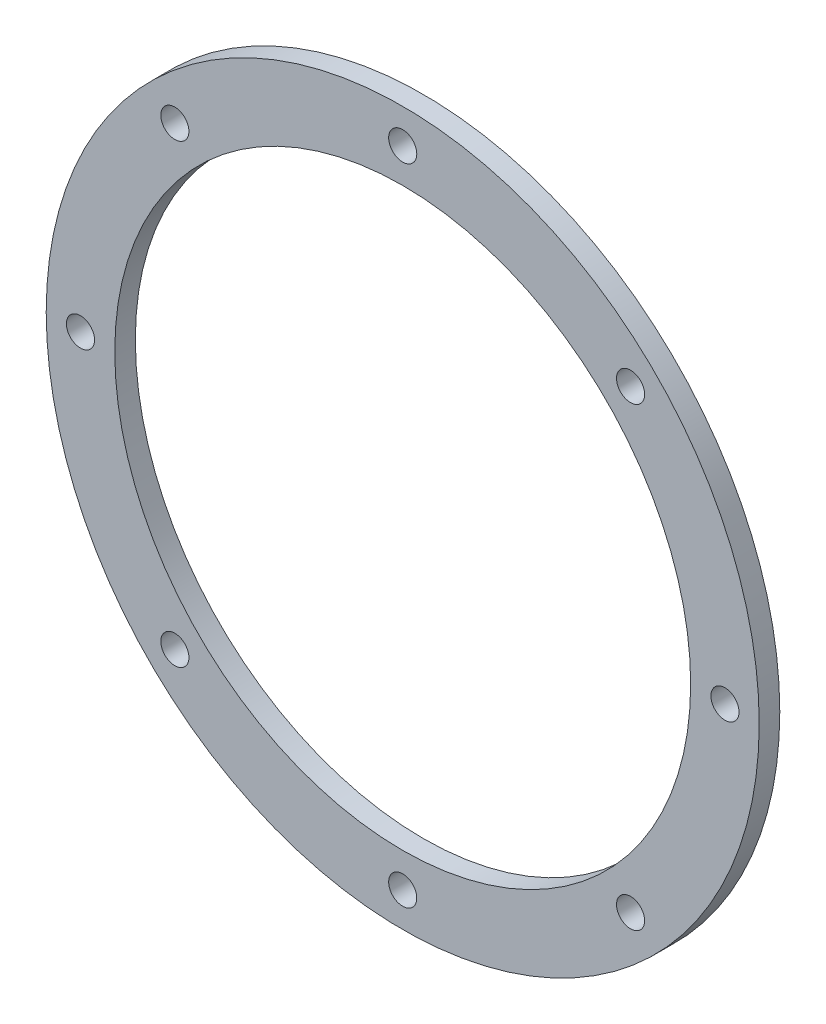
ISO-10303-21;
HEADER;
FILE_DESCRIPTION(('STEP AP214'),'2;1');
FILE_NAME('part.step','',(''),(''),'','','');
FILE_SCHEMA(('AUTOMOTIVE_DESIGN { 1 0 10303 214 1 1 1 1 }'));
ENDSEC;
DATA;
#1=APPLICATION_CONTEXT('core data for automotive mechanical design processes');
#2=APPLICATION_PROTOCOL_DEFINITION('international standard','automotive_design',2000,#1);
#3=PRODUCT_CONTEXT('',#1,'mechanical');
#4=PRODUCT('Part','Part','',(#3));
#5=PRODUCT_RELATED_PRODUCT_CATEGORY('part','',(#4));
#6=PRODUCT_DEFINITION_FORMATION('','',#4);
#7=PRODUCT_DEFINITION_CONTEXT('part definition',#1,'design');
#8=PRODUCT_DEFINITION('design','',#6,#7);
#9=PRODUCT_DEFINITION_SHAPE('','',#8);
#10=(LENGTH_UNIT() NAMED_UNIT(*) SI_UNIT(.MILLI.,.METRE.));
#11=(NAMED_UNIT(*) PLANE_ANGLE_UNIT() SI_UNIT($,.RADIAN.));
#12=(NAMED_UNIT(*) SI_UNIT($,.STERADIAN.) SOLID_ANGLE_UNIT());
#13=UNCERTAINTY_MEASURE_WITH_UNIT(LENGTH_MEASURE(1.E-05),#10,'distance_accuracy_value','');
#14=(GEOMETRIC_REPRESENTATION_CONTEXT(3) GLOBAL_UNCERTAINTY_ASSIGNED_CONTEXT((#13)) GLOBAL_UNIT_ASSIGNED_CONTEXT((#10,
#11,#12)) REPRESENTATION_CONTEXT('',''));
#15=CARTESIAN_POINT('',(0.,0.,0.));
#16=DIRECTION('',(0.,0.,1.));
#17=DIRECTION('',(1.,0.,0.));
#18=AXIS2_PLACEMENT_3D('',#15,#16,#17);
#19=CARTESIAN_POINT('',(0.,0.,3.));
#20=DIRECTION('',(0.,0.,1.));
#21=DIRECTION('',(1.,0.,0.));
#22=AXIS2_PLACEMENT_3D('',#19,#20,#21);
#23=PLANE('',#22);
#24=CARTESIAN_POINT('',(33.2340187157673,33.2340187157681,3.));
#25=DIRECTION('',(0.,0.,1.));
#26=DIRECTION('',(0.707106781186556,-0.707106781186539,0.));
#27=AXIS2_PLACEMENT_3D('',#24,#25,#26);
#28=CIRCLE('',#27,2.05);
#29=CARTESIAN_POINT('',(34.6835876171998,31.7844498143357,3.));
#30=VERTEX_POINT('',#29);
#31=EDGE_CURVE('E92',#30,#30,#28,.T.);
#32=ORIENTED_EDGE('',*,*,#31,.F.);
#33=EDGE_LOOP('',(#32));
#34=FACE_BOUND('',#33,.T.);
#35=CARTESIAN_POINT('',(47.,4.9236661129888E-13,3.));
#36=DIRECTION('',(0.,0.,1.));
#37=DIRECTION('',(0.,-1.,0.));
#38=AXIS2_PLACEMENT_3D('',#35,#36,#37);
#39=CIRCLE('',#38,2.05);
#40=CARTESIAN_POINT('',(47.,-2.04999999999951,3.));
#41=VERTEX_POINT('',#40);
#42=EDGE_CURVE('E86',#41,#41,#39,.T.);
#43=ORIENTED_EDGE('',*,*,#42,.F.);
#44=EDGE_LOOP('',(#43));
#45=FACE_BOUND('',#44,.T.);
#46=CARTESIAN_POINT('',(33.234018715768,-33.2340187157674,3.));
#47=DIRECTION('',(0.,0.,1.));
#48=DIRECTION('',(-0.707106781186541,-0.707106781186554,0.));
#49=AXIS2_PLACEMENT_3D('',#46,#47,#48);
#50=CIRCLE('',#49,2.05);
#51=CARTESIAN_POINT('',(31.7844498143356,-34.6835876171999,3.));
#52=VERTEX_POINT('',#51);
#53=EDGE_CURVE('E80',#52,#52,#50,.T.);
#54=ORIENTED_EDGE('',*,*,#53,.F.);
#55=EDGE_LOOP('',(#54));
#56=FACE_BOUND('',#55,.T.);
#57=CARTESIAN_POINT('',(0.,-47.,3.));
#58=DIRECTION('',(0.,0.,1.));
#59=DIRECTION('',(-1.,0.,0.));
#60=AXIS2_PLACEMENT_3D('',#57,#58,#59);
#61=CIRCLE('',#60,2.05);
#62=CARTESIAN_POINT('',(-2.05,-47.,3.));
#63=VERTEX_POINT('',#62);
#64=EDGE_CURVE('E74',#63,#63,#61,.T.);
#65=ORIENTED_EDGE('',*,*,#64,.F.);
#66=EDGE_LOOP('',(#65));
#67=FACE_BOUND('',#66,.T.);
#68=CARTESIAN_POINT('',(-33.2340187157676,-33.2340187157679,3.));
#69=DIRECTION('',(0.,0.,1.));
#70=DIRECTION('',(-0.707106781186551,0.707106781186544,0.));
#71=AXIS2_PLACEMENT_3D('',#68,#69,#70);
#72=CIRCLE('',#71,2.05);
#73=CARTESIAN_POINT('',(-34.6835876172,-31.7844498143355,3.));
#74=VERTEX_POINT('',#73);
#75=EDGE_CURVE('E68',#74,#74,#72,.T.);
#76=ORIENTED_EDGE('',*,*,#75,.F.);
#77=EDGE_LOOP('',(#76));
#78=FACE_BOUND('',#77,.T.);
#79=CARTESIAN_POINT('',(-47.,-1.64167365447625E-13,3.));
#80=DIRECTION('',(0.,0.,1.));
#81=DIRECTION('',(0.,1.,0.));
#82=AXIS2_PLACEMENT_3D('',#79,#80,#81);
#83=CIRCLE('',#82,2.05);
#84=CARTESIAN_POINT('',(-47.,2.04999999999984,3.));
#85=VERTEX_POINT('',#84);
#86=EDGE_CURVE('E62',#85,#85,#83,.T.);
#87=ORIENTED_EDGE('',*,*,#86,.F.);
#88=EDGE_LOOP('',(#87));
#89=FACE_BOUND('',#88,.T.);
#90=CARTESIAN_POINT('',(-33.2340187157678,33.2340187157677,3.));
#91=DIRECTION('',(0.,0.,1.));
#92=DIRECTION('',(0.707106781186546,0.707106781186549,0.));
#93=AXIS2_PLACEMENT_3D('',#90,#91,#92);
#94=CIRCLE('',#93,2.05);
#95=CARTESIAN_POINT('',(-31.7844498143354,34.6835876172001,3.));
#96=VERTEX_POINT('',#95);
#97=EDGE_CURVE('E56',#96,#96,#94,.T.);
#98=ORIENTED_EDGE('',*,*,#97,.F.);
#99=EDGE_LOOP('',(#98));
#100=FACE_BOUND('',#99,.T.);
#101=CARTESIAN_POINT('',(0.,47.,3.));
#102=DIRECTION('',(0.,0.,1.));
#103=DIRECTION('',(1.,0.,0.));
#104=AXIS2_PLACEMENT_3D('',#101,#102,#103);
#105=CIRCLE('',#104,2.05);
#106=CARTESIAN_POINT('',(2.05,47.,3.));
#107=VERTEX_POINT('',#106);
#108=EDGE_CURVE('E50',#107,#107,#105,.T.);
#109=ORIENTED_EDGE('',*,*,#108,.F.);
#110=EDGE_LOOP('',(#109));
#111=FACE_BOUND('',#110,.T.);
#112=CARTESIAN_POINT('',(0.,0.,3.));
#113=DIRECTION('',(0.,0.,1.));
#114=DIRECTION('',(1.,0.,0.));
#115=AXIS2_PLACEMENT_3D('',#112,#113,#114);
#116=CIRCLE('',#115,52.);
#117=CARTESIAN_POINT('',(52.,0.,3.));
#118=VERTEX_POINT('',#117);
#119=EDGE_CURVE('E10',#118,#118,#116,.T.);
#120=ORIENTED_EDGE('',*,*,#119,.T.);
#121=EDGE_LOOP('',(#120));
#122=FACE_BOUND('',#121,.T.);
#123=CARTESIAN_POINT('',(0.,0.,3.));
#124=DIRECTION('',(0.,0.,1.));
#125=DIRECTION('',(1.,0.,0.));
#126=AXIS2_PLACEMENT_3D('',#123,#124,#125);
#127=CIRCLE('',#126,42.);
#128=CARTESIAN_POINT('',(42.,0.,3.));
#129=VERTEX_POINT('',#128);
#130=EDGE_CURVE('E42',#129,#129,#127,.T.);
#131=ORIENTED_EDGE('',*,*,#130,.F.);
#132=EDGE_LOOP('',(#131));
#133=FACE_BOUND('',#132,.T.);
#134=ADVANCED_FACE('F31',(#34,#45,#56,#67,#78,#89,#100,#111,#122,#133),#23,.T.);
#135=CARTESIAN_POINT('',(0.,0.,0.));
#136=DIRECTION('',(0.,0.,1.));
#137=DIRECTION('',(1.,0.,0.));
#138=AXIS2_PLACEMENT_3D('',#135,#136,#137);
#139=PLANE('',#138);
#140=CARTESIAN_POINT('',(33.2340187157673,33.2340187157681,0.));
#141=DIRECTION('',(0.,0.,1.));
#142=DIRECTION('',(0.707106781186556,-0.707106781186539,0.));
#143=AXIS2_PLACEMENT_3D('',#140,#141,#142);
#144=CIRCLE('',#143,2.05);
#145=CARTESIAN_POINT('',(34.6835876171998,31.7844498143357,0.));
#146=VERTEX_POINT('',#145);
#147=EDGE_CURVE('E89',#146,#146,#144,.T.);
#148=ORIENTED_EDGE('',*,*,#147,.T.);
#149=EDGE_LOOP('',(#148));
#150=FACE_BOUND('',#149,.T.);
#151=CARTESIAN_POINT('',(47.,4.9236661129888E-13,0.));
#152=DIRECTION('',(0.,0.,1.));
#153=DIRECTION('',(0.,-1.,0.));
#154=AXIS2_PLACEMENT_3D('',#151,#152,#153);
#155=CIRCLE('',#154,2.05);
#156=CARTESIAN_POINT('',(47.,-2.04999999999951,0.));
#157=VERTEX_POINT('',#156);
#158=EDGE_CURVE('E83',#157,#157,#155,.T.);
#159=ORIENTED_EDGE('',*,*,#158,.T.);
#160=EDGE_LOOP('',(#159));
#161=FACE_BOUND('',#160,.T.);
#162=CARTESIAN_POINT('',(33.234018715768,-33.2340187157674,0.));
#163=DIRECTION('',(0.,0.,1.));
#164=DIRECTION('',(-0.707106781186541,-0.707106781186554,0.));
#165=AXIS2_PLACEMENT_3D('',#162,#163,#164);
#166=CIRCLE('',#165,2.05);
#167=CARTESIAN_POINT('',(31.7844498143356,-34.6835876171999,0.));
#168=VERTEX_POINT('',#167);
#169=EDGE_CURVE('E77',#168,#168,#166,.T.);
#170=ORIENTED_EDGE('',*,*,#169,.T.);
#171=EDGE_LOOP('',(#170));
#172=FACE_BOUND('',#171,.T.);
#173=CARTESIAN_POINT('',(0.,-47.,0.));
#174=DIRECTION('',(0.,0.,1.));
#175=DIRECTION('',(-1.,0.,0.));
#176=AXIS2_PLACEMENT_3D('',#173,#174,#175);
#177=CIRCLE('',#176,2.05);
#178=CARTESIAN_POINT('',(-2.05,-47.,0.));
#179=VERTEX_POINT('',#178);
#180=EDGE_CURVE('E71',#179,#179,#177,.T.);
#181=ORIENTED_EDGE('',*,*,#180,.T.);
#182=EDGE_LOOP('',(#181));
#183=FACE_BOUND('',#182,.T.);
#184=CARTESIAN_POINT('',(-33.2340187157676,-33.2340187157679,0.));
#185=DIRECTION('',(0.,0.,1.));
#186=DIRECTION('',(-0.707106781186551,0.707106781186544,0.));
#187=AXIS2_PLACEMENT_3D('',#184,#185,#186);
#188=CIRCLE('',#187,2.05);
#189=CARTESIAN_POINT('',(-34.6835876172,-31.7844498143355,0.));
#190=VERTEX_POINT('',#189);
#191=EDGE_CURVE('E65',#190,#190,#188,.T.);
#192=ORIENTED_EDGE('',*,*,#191,.T.);
#193=EDGE_LOOP('',(#192));
#194=FACE_BOUND('',#193,.T.);
#195=CARTESIAN_POINT('',(-47.,-1.64167365447625E-13,0.));
#196=DIRECTION('',(0.,0.,1.));
#197=DIRECTION('',(0.,1.,0.));
#198=AXIS2_PLACEMENT_3D('',#195,#196,#197);
#199=CIRCLE('',#198,2.05);
#200=CARTESIAN_POINT('',(-47.,2.04999999999984,0.));
#201=VERTEX_POINT('',#200);
#202=EDGE_CURVE('E59',#201,#201,#199,.T.);
#203=ORIENTED_EDGE('',*,*,#202,.T.);
#204=EDGE_LOOP('',(#203));
#205=FACE_BOUND('',#204,.T.);
#206=CARTESIAN_POINT('',(-33.2340187157678,33.2340187157677,0.));
#207=DIRECTION('',(0.,0.,1.));
#208=DIRECTION('',(0.707106781186546,0.707106781186549,0.));
#209=AXIS2_PLACEMENT_3D('',#206,#207,#208);
#210=CIRCLE('',#209,2.05);
#211=CARTESIAN_POINT('',(-31.7844498143354,34.6835876172001,0.));
#212=VERTEX_POINT('',#211);
#213=EDGE_CURVE('E53',#212,#212,#210,.T.);
#214=ORIENTED_EDGE('',*,*,#213,.T.);
#215=EDGE_LOOP('',(#214));
#216=FACE_BOUND('',#215,.T.);
#217=CARTESIAN_POINT('',(0.,47.,0.));
#218=DIRECTION('',(0.,0.,1.));
#219=DIRECTION('',(1.,0.,0.));
#220=AXIS2_PLACEMENT_3D('',#217,#218,#219);
#221=CIRCLE('',#220,2.05);
#222=CARTESIAN_POINT('',(2.05,47.,0.));
#223=VERTEX_POINT('',#222);
#224=EDGE_CURVE('E47',#223,#223,#221,.T.);
#225=ORIENTED_EDGE('',*,*,#224,.T.);
#226=EDGE_LOOP('',(#225));
#227=FACE_BOUND('',#226,.T.);
#228=CARTESIAN_POINT('',(0.,0.,0.));
#229=DIRECTION('',(0.,0.,1.));
#230=DIRECTION('',(1.,0.,0.));
#231=AXIS2_PLACEMENT_3D('',#228,#229,#230);
#232=CIRCLE('',#231,52.);
#233=CARTESIAN_POINT('',(52.,0.,0.));
#234=VERTEX_POINT('',#233);
#235=EDGE_CURVE('E35',#234,#234,#232,.T.);
#236=ORIENTED_EDGE('',*,*,#235,.F.);
#237=EDGE_LOOP('',(#236));
#238=FACE_BOUND('',#237,.T.);
#239=CARTESIAN_POINT('',(0.,0.,0.));
#240=DIRECTION('',(0.,0.,1.));
#241=DIRECTION('',(1.,0.,0.));
#242=AXIS2_PLACEMENT_3D('',#239,#240,#241);
#243=CIRCLE('',#242,42.);
#244=CARTESIAN_POINT('',(42.,0.,0.));
#245=VERTEX_POINT('',#244);
#246=EDGE_CURVE('E44',#245,#245,#243,.T.);
#247=ORIENTED_EDGE('',*,*,#246,.T.);
#248=EDGE_LOOP('',(#247));
#249=FACE_BOUND('',#248,.T.);
#250=ADVANCED_FACE('F98',(#150,#161,#172,#183,#194,#205,#216,#227,#238,#249),#139,.F.);
#251=CARTESIAN_POINT('',(0.,0.,3.));
#252=DIRECTION('',(0.,0.,-1.));
#253=DIRECTION('',(-1.,0.,0.));
#254=AXIS2_PLACEMENT_3D('',#251,#252,#253);
#255=CYLINDRICAL_SURFACE('',#254,52.);
#256=ORIENTED_EDGE('',*,*,#119,.F.);
#257=EDGE_LOOP('',(#256));
#258=FACE_BOUND('',#257,.T.);
#259=ORIENTED_EDGE('',*,*,#235,.T.);
#260=EDGE_LOOP('',(#259));
#261=FACE_BOUND('',#260,.T.);
#262=ADVANCED_FACE('F33',(#258,#261),#255,.T.);
#263=CARTESIAN_POINT('',(0.,0.,3.));
#264=DIRECTION('',(0.,0.,-1.));
#265=DIRECTION('',(-1.,0.,0.));
#266=AXIS2_PLACEMENT_3D('',#263,#264,#265);
#267=CYLINDRICAL_SURFACE('',#266,42.);
#268=ORIENTED_EDGE('',*,*,#130,.T.);
#269=EDGE_LOOP('',(#268));
#270=FACE_BOUND('',#269,.T.);
#271=ORIENTED_EDGE('',*,*,#246,.F.);
#272=EDGE_LOOP('',(#271));
#273=FACE_BOUND('',#272,.T.);
#274=ADVANCED_FACE('F127',(#270,#273),#267,.F.);
#275=CARTESIAN_POINT('',(0.,47.,0.));
#276=DIRECTION('',(0.,0.,1.));
#277=DIRECTION('',(1.,0.,0.));
#278=AXIS2_PLACEMENT_3D('',#275,#276,#277);
#279=CYLINDRICAL_SURFACE('',#278,2.05);
#280=ORIENTED_EDGE('',*,*,#224,.F.);
#281=EDGE_LOOP('',(#280));
#282=FACE_BOUND('',#281,.T.);
#283=ORIENTED_EDGE('',*,*,#108,.T.);
#284=EDGE_LOOP('',(#283));
#285=FACE_BOUND('',#284,.T.);
#286=ADVANCED_FACE('F130',(#282,#285),#279,.F.);
#287=CARTESIAN_POINT('',(-33.2340187157678,33.2340187157677,0.));
#288=DIRECTION('',(0.,0.,1.));
#289=DIRECTION('',(1.,0.,0.));
#290=AXIS2_PLACEMENT_3D('',#287,#288,#289);
#291=CYLINDRICAL_SURFACE('',#290,2.05);
#292=ORIENTED_EDGE('',*,*,#213,.F.);
#293=EDGE_LOOP('',(#292));
#294=FACE_BOUND('',#293,.T.);
#295=ORIENTED_EDGE('',*,*,#97,.T.);
#296=EDGE_LOOP('',(#295));
#297=FACE_BOUND('',#296,.T.);
#298=ADVANCED_FACE('F142',(#294,#297),#291,.F.);
#299=CARTESIAN_POINT('',(-47.,-1.64167365447625E-13,0.));
#300=DIRECTION('',(0.,0.,1.));
#301=DIRECTION('',(1.,0.,0.));
#302=AXIS2_PLACEMENT_3D('',#299,#300,#301);
#303=CYLINDRICAL_SURFACE('',#302,2.05);
#304=ORIENTED_EDGE('',*,*,#202,.F.);
#305=EDGE_LOOP('',(#304));
#306=FACE_BOUND('',#305,.T.);
#307=ORIENTED_EDGE('',*,*,#86,.T.);
#308=EDGE_LOOP('',(#307));
#309=FACE_BOUND('',#308,.T.);
#310=ADVANCED_FACE('F146',(#306,#309),#303,.F.);
#311=CARTESIAN_POINT('',(-33.2340187157676,-33.2340187157679,0.));
#312=DIRECTION('',(0.,0.,1.));
#313=DIRECTION('',(1.,0.,0.));
#314=AXIS2_PLACEMENT_3D('',#311,#312,#313);
#315=CYLINDRICAL_SURFACE('',#314,2.05);
#316=ORIENTED_EDGE('',*,*,#191,.F.);
#317=EDGE_LOOP('',(#316));
#318=FACE_BOUND('',#317,.T.);
#319=ORIENTED_EDGE('',*,*,#75,.T.);
#320=EDGE_LOOP('',(#319));
#321=FACE_BOUND('',#320,.T.);
#322=ADVANCED_FACE('F150',(#318,#321),#315,.F.);
#323=CARTESIAN_POINT('',(0.,-47.,0.));
#324=DIRECTION('',(0.,0.,1.));
#325=DIRECTION('',(1.,0.,0.));
#326=AXIS2_PLACEMENT_3D('',#323,#324,#325);
#327=CYLINDRICAL_SURFACE('',#326,2.05);
#328=ORIENTED_EDGE('',*,*,#180,.F.);
#329=EDGE_LOOP('',(#328));
#330=FACE_BOUND('',#329,.T.);
#331=ORIENTED_EDGE('',*,*,#64,.T.);
#332=EDGE_LOOP('',(#331));
#333=FACE_BOUND('',#332,.T.);
#334=ADVANCED_FACE('F154',(#330,#333),#327,.F.);
#335=CARTESIAN_POINT('',(33.234018715768,-33.2340187157674,0.));
#336=DIRECTION('',(0.,0.,1.));
#337=DIRECTION('',(1.,0.,0.));
#338=AXIS2_PLACEMENT_3D('',#335,#336,#337);
#339=CYLINDRICAL_SURFACE('',#338,2.05);
#340=ORIENTED_EDGE('',*,*,#169,.F.);
#341=EDGE_LOOP('',(#340));
#342=FACE_BOUND('',#341,.T.);
#343=ORIENTED_EDGE('',*,*,#53,.T.);
#344=EDGE_LOOP('',(#343));
#345=FACE_BOUND('',#344,.T.);
#346=ADVANCED_FACE('F158',(#342,#345),#339,.F.);
#347=CARTESIAN_POINT('',(47.,4.9236661129888E-13,0.));
#348=DIRECTION('',(0.,0.,1.));
#349=DIRECTION('',(1.,0.,0.));
#350=AXIS2_PLACEMENT_3D('',#347,#348,#349);
#351=CYLINDRICAL_SURFACE('',#350,2.05);
#352=ORIENTED_EDGE('',*,*,#158,.F.);
#353=EDGE_LOOP('',(#352));
#354=FACE_BOUND('',#353,.T.);
#355=ORIENTED_EDGE('',*,*,#42,.T.);
#356=EDGE_LOOP('',(#355));
#357=FACE_BOUND('',#356,.T.);
#358=ADVANCED_FACE('F104',(#354,#357),#351,.F.);
#359=CARTESIAN_POINT('',(33.2340187157673,33.2340187157681,0.));
#360=DIRECTION('',(0.,0.,1.));
#361=DIRECTION('',(1.,0.,0.));
#362=AXIS2_PLACEMENT_3D('',#359,#360,#361);
#363=CYLINDRICAL_SURFACE('',#362,2.05);
#364=ORIENTED_EDGE('',*,*,#147,.F.);
#365=EDGE_LOOP('',(#364));
#366=FACE_BOUND('',#365,.T.);
#367=ORIENTED_EDGE('',*,*,#31,.T.);
#368=EDGE_LOOP('',(#367));
#369=FACE_BOUND('',#368,.T.);
#370=ADVANCED_FACE('F101',(#366,#369),#363,.F.);
#371=CLOSED_SHELL('',(#134,#250,#262,#274,#286,#298,#310,#322,#334,#346,#358,#370));
#372=MANIFOLD_SOLID_BREP('B2',#371);
#373=ADVANCED_BREP_SHAPE_REPRESENTATION('',(#18,#372),#14);
#374=SHAPE_DEFINITION_REPRESENTATION(#9,#373);
ENDSEC;
END-ISO-10303-21;
